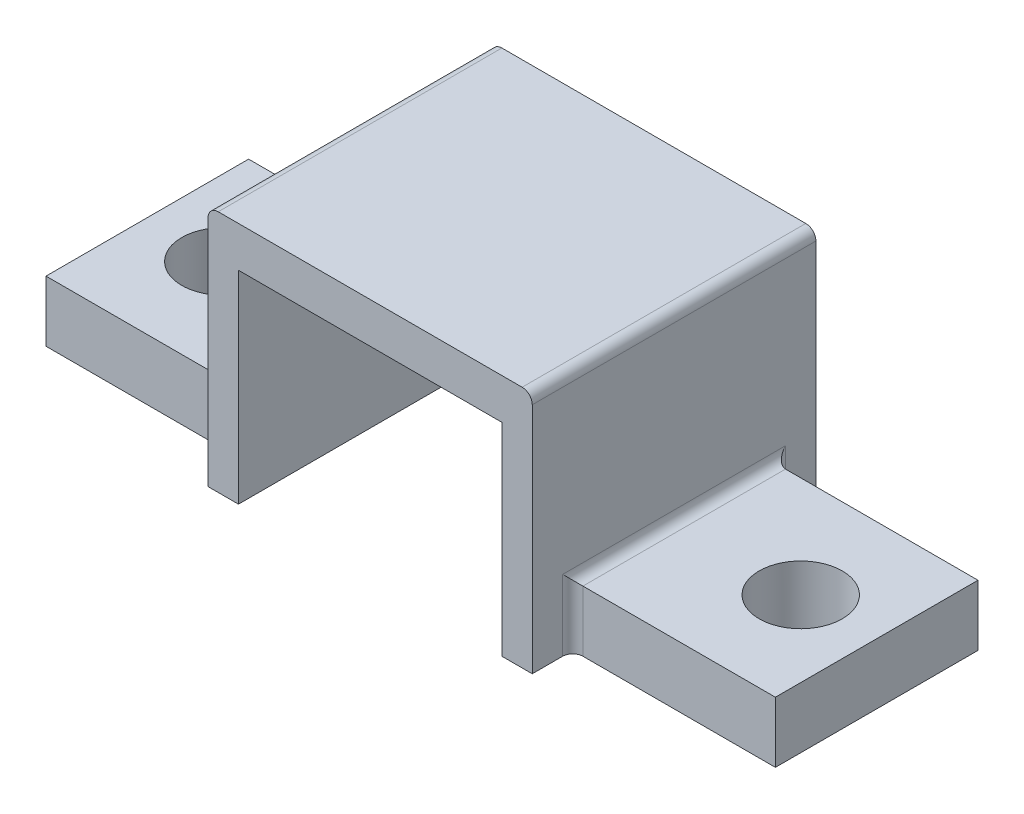
ISO-10303-21;
HEADER;
FILE_DESCRIPTION(('STEP AP214'),'2;1');
FILE_NAME('part.step','',(''),(''),'','','');
FILE_SCHEMA(('AUTOMOTIVE_DESIGN { 1 0 10303 214 1 1 1 1 }'));
ENDSEC;
DATA;
#1=APPLICATION_CONTEXT('core data for automotive mechanical design processes');
#2=APPLICATION_PROTOCOL_DEFINITION('international standard','automotive_design',2000,#1);
#3=PRODUCT_CONTEXT('',#1,'mechanical');
#4=PRODUCT('Part','Part','',(#3));
#5=PRODUCT_RELATED_PRODUCT_CATEGORY('part','',(#4));
#6=PRODUCT_DEFINITION_FORMATION('','',#4);
#7=PRODUCT_DEFINITION_CONTEXT('part definition',#1,'design');
#8=PRODUCT_DEFINITION('design','',#6,#7);
#9=PRODUCT_DEFINITION_SHAPE('','',#8);
#10=(LENGTH_UNIT() NAMED_UNIT(*) SI_UNIT(.MILLI.,.METRE.));
#11=(NAMED_UNIT(*) PLANE_ANGLE_UNIT() SI_UNIT($,.RADIAN.));
#12=(NAMED_UNIT(*) SI_UNIT($,.STERADIAN.) SOLID_ANGLE_UNIT());
#13=UNCERTAINTY_MEASURE_WITH_UNIT(LENGTH_MEASURE(1.E-05),#10,'distance_accuracy_value','');
#14=(GEOMETRIC_REPRESENTATION_CONTEXT(3) GLOBAL_UNCERTAINTY_ASSIGNED_CONTEXT((#13)) GLOBAL_UNIT_ASSIGNED_CONTEXT((#10,
#11,#12)) REPRESENTATION_CONTEXT('',''));
#15=CARTESIAN_POINT('',(0.,0.,0.));
#16=DIRECTION('',(0.,0.,1.));
#17=DIRECTION('',(1.,0.,0.));
#18=AXIS2_PLACEMENT_3D('',#15,#16,#17);
#19=CARTESIAN_POINT('',(8.,-6.,7.));
#20=DIRECTION('',(-1.,0.,0.));
#21=DIRECTION('',(0.,0.,1.));
#22=AXIS2_PLACEMENT_3D('',#19,#20,#21);
#23=PLANE('',#22);
#24=DIRECTION('',(0.,1.,0.));
#25=VECTOR('',#24,1.);
#26=CARTESIAN_POINT('',(8.,-6.,-7.));
#27=LINE('',#26,#25);
#28=CARTESIAN_POINT('',(8.,-6.,-7.));
#29=VERTEX_POINT('',#28);
#30=CARTESIAN_POINT('',(8.,5.5,-7.));
#31=VERTEX_POINT('',#30);
#32=EDGE_CURVE('E273',#29,#31,#27,.T.);
#33=ORIENTED_EDGE('',*,*,#32,.T.);
#34=DIRECTION('',(0.,0.,-1.));
#35=VECTOR('',#34,1.);
#36=CARTESIAN_POINT('',(8.,5.5,7.));
#37=LINE('',#36,#35);
#38=CARTESIAN_POINT('',(8.,5.5,7.));
#39=VERTEX_POINT('',#38);
#40=EDGE_CURVE('E326',#31,#39,#37,.F.);
#41=ORIENTED_EDGE('',*,*,#40,.T.);
#42=DIRECTION('',(0.,1.,0.));
#43=VECTOR('',#42,1.);
#44=CARTESIAN_POINT('',(8.,-6.,7.));
#45=LINE('',#44,#43);
#46=CARTESIAN_POINT('',(8.,-6.,7.));
#47=VERTEX_POINT('',#46);
#48=EDGE_CURVE('E280',#47,#39,#45,.T.);
#49=ORIENTED_EDGE('',*,*,#48,.F.);
#50=DIRECTION('',(0.,0.,-1.));
#51=VECTOR('',#50,1.);
#52=CARTESIAN_POINT('',(8.,-6.,7.));
#53=LINE('',#52,#51);
#54=CARTESIAN_POINT('',(8.,-6.,5.5));
#55=VERTEX_POINT('',#54);
#56=EDGE_CURVE('E305',#47,#55,#53,.T.);
#57=ORIENTED_EDGE('',*,*,#56,.T.);
#58=DIRECTION('',(0.,-1.,0.));
#59=VECTOR('',#58,1.);
#60=CARTESIAN_POINT('',(8.,-6.,5.5));
#61=LINE('',#60,#59);
#62=CARTESIAN_POINT('',(8.,-2.5,5.5));
#63=VERTEX_POINT('',#62);
#64=EDGE_CURVE('E324',#55,#63,#61,.F.);
#65=ORIENTED_EDGE('',*,*,#64,.T.);
#66=DIRECTION('',(0.,0.,1.));
#67=VECTOR('',#66,1.);
#68=CARTESIAN_POINT('',(8.,-2.5,-5.));
#69=LINE('',#68,#67);
#70=CARTESIAN_POINT('',(8.,-2.5,-5.5));
#71=VERTEX_POINT('',#70);
#72=EDGE_CURVE('E322',#63,#71,#69,.F.);
#73=ORIENTED_EDGE('',*,*,#72,.T.);
#74=DIRECTION('',(0.,-1.,0.));
#75=VECTOR('',#74,1.);
#76=CARTESIAN_POINT('',(8.,-6.,-5.5));
#77=LINE('',#76,#75);
#78=CARTESIAN_POINT('',(8.,-6.,-5.5));
#79=VERTEX_POINT('',#78);
#80=EDGE_CURVE('E320',#71,#79,#77,.T.);
#81=ORIENTED_EDGE('',*,*,#80,.T.);
#82=EDGE_CURVE('E293',#79,#29,#53,.T.);
#83=ORIENTED_EDGE('',*,*,#82,.T.);
#84=EDGE_LOOP('',(#33,#41,#49,#57,#65,#73,#81,#83));
#85=FACE_BOUND('',#84,.T.);
#86=ADVANCED_FACE('F43',(#85),#23,.F.);
#87=CARTESIAN_POINT('',(-8.,-6.,7.));
#88=DIRECTION('',(1.,0.,0.));
#89=DIRECTION('',(0.,0.,-1.));
#90=AXIS2_PLACEMENT_3D('',#87,#88,#89);
#91=PLANE('',#90);
#92=DIRECTION('',(0.,-1.,0.));
#93=VECTOR('',#92,1.);
#94=CARTESIAN_POINT('',(-8.,-6.,7.));
#95=LINE('',#94,#93);
#96=CARTESIAN_POINT('',(-8.,5.5,7.));
#97=VERTEX_POINT('',#96);
#98=CARTESIAN_POINT('',(-8.,-6.,7.));
#99=VERTEX_POINT('',#98);
#100=EDGE_CURVE('E287',#97,#99,#95,.T.);
#101=ORIENTED_EDGE('',*,*,#100,.F.);
#102=DIRECTION('',(0.,0.,-1.));
#103=VECTOR('',#102,1.);
#104=CARTESIAN_POINT('',(-8.,5.5,7.));
#105=LINE('',#104,#103);
#106=CARTESIAN_POINT('',(-8.,5.5,-7.));
#107=VERTEX_POINT('',#106);
#108=EDGE_CURVE('E338',#97,#107,#105,.T.);
#109=ORIENTED_EDGE('',*,*,#108,.T.);
#110=DIRECTION('',(0.,-1.,0.));
#111=VECTOR('',#110,1.);
#112=CARTESIAN_POINT('',(-8.,-6.,-7.));
#113=LINE('',#112,#111);
#114=CARTESIAN_POINT('',(-8.,-6.,-7.));
#115=VERTEX_POINT('',#114);
#116=EDGE_CURVE('E299',#107,#115,#113,.T.);
#117=ORIENTED_EDGE('',*,*,#116,.T.);
#118=DIRECTION('',(0.,0.,-1.));
#119=VECTOR('',#118,1.);
#120=CARTESIAN_POINT('',(-8.,-6.,7.));
#121=LINE('',#120,#119);
#122=CARTESIAN_POINT('',(-8.,-6.,-5.5));
#123=VERTEX_POINT('',#122);
#124=EDGE_CURVE('E308',#123,#115,#121,.T.);
#125=ORIENTED_EDGE('',*,*,#124,.F.);
#126=DIRECTION('',(0.,-1.,0.));
#127=VECTOR('',#126,1.);
#128=CARTESIAN_POINT('',(-8.,-6.,-5.5));
#129=LINE('',#128,#127);
#130=CARTESIAN_POINT('',(-8.,-2.5,-5.5));
#131=VERTEX_POINT('',#130);
#132=EDGE_CURVE('E336',#123,#131,#129,.F.);
#133=ORIENTED_EDGE('',*,*,#132,.T.);
#134=DIRECTION('',(0.,0.,-1.));
#135=VECTOR('',#134,1.);
#136=CARTESIAN_POINT('',(-8.,-2.5,5.));
#137=LINE('',#136,#135);
#138=CARTESIAN_POINT('',(-8.,-2.5,5.5));
#139=VERTEX_POINT('',#138);
#140=EDGE_CURVE('E334',#131,#139,#137,.F.);
#141=ORIENTED_EDGE('',*,*,#140,.T.);
#142=DIRECTION('',(0.,-1.,0.));
#143=VECTOR('',#142,1.);
#144=CARTESIAN_POINT('',(-8.,-6.,5.5));
#145=LINE('',#144,#143);
#146=CARTESIAN_POINT('',(-8.,-6.,5.5));
#147=VERTEX_POINT('',#146);
#148=EDGE_CURVE('E332',#139,#147,#145,.T.);
#149=ORIENTED_EDGE('',*,*,#148,.T.);
#150=EDGE_CURVE('E309',#99,#147,#121,.T.);
#151=ORIENTED_EDGE('',*,*,#150,.F.);
#152=EDGE_LOOP('',(#101,#109,#117,#125,#133,#141,#149,#151));
#153=FACE_BOUND('',#152,.T.);
#154=ADVANCED_FACE('F420',(#153),#91,.F.);
#155=CARTESIAN_POINT('',(-8.,-6.,7.));
#156=DIRECTION('',(0.,1.,0.));
#157=DIRECTION('',(0.,0.,1.));
#158=AXIS2_PLACEMENT_3D('',#155,#156,#157);
#159=PLANE('',#158);
#160=CARTESIAN_POINT('',(14.25,-6.,0.));
#161=DIRECTION('',(0.,1.,0.));
#162=DIRECTION('',(0.,0.,1.));
#163=AXIS2_PLACEMENT_3D('',#160,#161,#162);
#164=CIRCLE('',#163,2.05);
#165=CARTESIAN_POINT('',(14.25,-6.,2.05));
#166=VERTEX_POINT('',#165);
#167=EDGE_CURVE('E367',#166,#166,#164,.F.);
#168=ORIENTED_EDGE('',*,*,#167,.F.);
#169=EDGE_LOOP('',(#168));
#170=FACE_BOUND('',#169,.T.);
#171=DIRECTION('',(1.,0.,0.));
#172=VECTOR('',#171,1.);
#173=CARTESIAN_POINT('',(-8.,-6.,7.));
#174=LINE('',#173,#172);
#175=CARTESIAN_POINT('',(6.5,-6.,7.));
#176=VERTEX_POINT('',#175);
#177=EDGE_CURVE('E289',#176,#47,#174,.T.);
#178=ORIENTED_EDGE('',*,*,#177,.F.);
#179=DIRECTION('',(0.,0.,1.));
#180=VECTOR('',#179,1.);
#181=CARTESIAN_POINT('',(6.5,-6.,-7.));
#182=LINE('',#181,#180);
#183=CARTESIAN_POINT('',(6.5,-6.,-7.));
#184=VERTEX_POINT('',#183);
#185=EDGE_CURVE('E271',#184,#176,#182,.T.);
#186=ORIENTED_EDGE('',*,*,#185,.F.);
#187=DIRECTION('',(1.,0.,0.));
#188=VECTOR('',#187,1.);
#189=CARTESIAN_POINT('',(-8.,-6.,-7.));
#190=LINE('',#189,#188);
#191=EDGE_CURVE('E302',#184,#29,#190,.T.);
#192=ORIENTED_EDGE('',*,*,#191,.T.);
#193=ORIENTED_EDGE('',*,*,#82,.F.);
#194=CARTESIAN_POINT('',(8.5,-6.,-5.5));
#195=DIRECTION('',(0.,1.,0.));
#196=DIRECTION('',(0.,0.,1.));
#197=AXIS2_PLACEMENT_3D('',#194,#195,#196);
#198=CIRCLE('',#197,0.5);
#199=CARTESIAN_POINT('',(8.5,-6.,-5.));
#200=VERTEX_POINT('',#199);
#201=EDGE_CURVE('E354',#79,#200,#198,.T.);
#202=ORIENTED_EDGE('',*,*,#201,.T.);
#203=DIRECTION('',(-1.,0.,0.));
#204=VECTOR('',#203,1.);
#205=CARTESIAN_POINT('',(0.,-6.,-5.));
#206=LINE('',#205,#204);
#207=CARTESIAN_POINT('',(18.,-6.,-5.));
#208=VERTEX_POINT('',#207);
#209=EDGE_CURVE('E243',#208,#200,#206,.T.);
#210=ORIENTED_EDGE('',*,*,#209,.F.);
#211=DIRECTION('',(0.,0.,1.));
#212=VECTOR('',#211,1.);
#213=CARTESIAN_POINT('',(18.,-6.,0.));
#214=LINE('',#213,#212);
#215=CARTESIAN_POINT('',(18.,-6.,5.));
#216=VERTEX_POINT('',#215);
#217=EDGE_CURVE('E246',#208,#216,#214,.T.);
#218=ORIENTED_EDGE('',*,*,#217,.T.);
#219=DIRECTION('',(-1.,0.,0.));
#220=VECTOR('',#219,1.);
#221=CARTESIAN_POINT('',(0.,-6.,5.));
#222=LINE('',#221,#220);
#223=CARTESIAN_POINT('',(8.5,-6.,5.));
#224=VERTEX_POINT('',#223);
#225=EDGE_CURVE('E236',#216,#224,#222,.T.);
#226=ORIENTED_EDGE('',*,*,#225,.T.);
#227=CARTESIAN_POINT('',(8.5,-6.,5.5));
#228=DIRECTION('',(0.,1.,0.));
#229=DIRECTION('',(0.,0.,1.));
#230=AXIS2_PLACEMENT_3D('',#227,#228,#229);
#231=CIRCLE('',#230,0.5);
#232=EDGE_CURVE('E352',#224,#55,#231,.T.);
#233=ORIENTED_EDGE('',*,*,#232,.T.);
#234=ORIENTED_EDGE('',*,*,#56,.F.);
#235=EDGE_LOOP('',(#178,#186,#192,#193,#202,#210,#218,#226,#233,#234));
#236=FACE_BOUND('',#235,.T.);
#237=ADVANCED_FACE('F386',(#170,#236),#159,.F.);
#238=CARTESIAN_POINT('',(-8.,6.,7.));
#239=DIRECTION('',(0.,-1.,0.));
#240=DIRECTION('',(0.,0.,-1.));
#241=AXIS2_PLACEMENT_3D('',#238,#239,#240);
#242=PLANE('',#241);
#243=DIRECTION('',(-1.,0.,0.));
#244=VECTOR('',#243,1.);
#245=CARTESIAN_POINT('',(-8.,6.,7.));
#246=LINE('',#245,#244);
#247=CARTESIAN_POINT('',(7.5,6.,7.));
#248=VERTEX_POINT('',#247);
#249=CARTESIAN_POINT('',(-7.5,6.,7.));
#250=VERTEX_POINT('',#249);
#251=EDGE_CURVE('E283',#248,#250,#246,.T.);
#252=ORIENTED_EDGE('',*,*,#251,.F.);
#253=DIRECTION('',(0.,0.,-1.));
#254=VECTOR('',#253,1.);
#255=CARTESIAN_POINT('',(7.5,6.,7.));
#256=LINE('',#255,#254);
#257=CARTESIAN_POINT('',(7.5,6.,-7.));
#258=VERTEX_POINT('',#257);
#259=EDGE_CURVE('E313',#248,#258,#256,.T.);
#260=ORIENTED_EDGE('',*,*,#259,.T.);
#261=DIRECTION('',(-1.,0.,0.));
#262=VECTOR('',#261,1.);
#263=CARTESIAN_POINT('',(-8.,6.,-7.));
#264=LINE('',#263,#262);
#265=CARTESIAN_POINT('',(-7.5,6.,-7.));
#266=VERTEX_POINT('',#265);
#267=EDGE_CURVE('E296',#258,#266,#264,.T.);
#268=ORIENTED_EDGE('',*,*,#267,.T.);
#269=DIRECTION('',(0.,0.,-1.));
#270=VECTOR('',#269,1.);
#271=CARTESIAN_POINT('',(-7.5,6.,7.));
#272=LINE('',#271,#270);
#273=EDGE_CURVE('E311',#266,#250,#272,.F.);
#274=ORIENTED_EDGE('',*,*,#273,.T.);
#275=EDGE_LOOP('',(#252,#260,#268,#274));
#276=FACE_BOUND('',#275,.T.);
#277=ADVANCED_FACE('F384',(#276),#242,.F.);
#278=CARTESIAN_POINT('',(-14.25,-6.,0.));
#279=DIRECTION('',(0.,1.,0.));
#280=DIRECTION('',(0.,0.,1.));
#281=AXIS2_PLACEMENT_3D('',#278,#279,#280);
#282=CIRCLE('',#281,2.05);
#283=CARTESIAN_POINT('',(-14.25,-6.,2.05));
#284=VERTEX_POINT('',#283);
#285=EDGE_CURVE('E222',#284,#284,#282,.F.);
#286=ORIENTED_EDGE('',*,*,#285,.F.);
#287=EDGE_LOOP('',(#286));
#288=FACE_BOUND('',#287,.T.);
#289=CARTESIAN_POINT('',(-6.5,-6.,-7.));
#290=VERTEX_POINT('',#289);
#291=EDGE_CURVE('E284',#115,#290,#190,.T.);
#292=ORIENTED_EDGE('',*,*,#291,.T.);
#293=DIRECTION('',(0.,0.,1.));
#294=VECTOR('',#293,1.);
#295=CARTESIAN_POINT('',(-6.5,-6.,-7.));
#296=LINE('',#295,#294);
#297=CARTESIAN_POINT('',(-6.5,-6.,7.));
#298=VERTEX_POINT('',#297);
#299=EDGE_CURVE('E274',#290,#298,#296,.T.);
#300=ORIENTED_EDGE('',*,*,#299,.T.);
#301=EDGE_CURVE('E290',#99,#298,#174,.T.);
#302=ORIENTED_EDGE('',*,*,#301,.F.);
#303=ORIENTED_EDGE('',*,*,#150,.T.);
#304=CARTESIAN_POINT('',(-8.5,-6.,5.5));
#305=DIRECTION('',(0.,1.,0.));
#306=DIRECTION('',(0.,0.,1.));
#307=AXIS2_PLACEMENT_3D('',#304,#305,#306);
#308=CIRCLE('',#307,0.5);
#309=CARTESIAN_POINT('',(-8.5,-6.,5.));
#310=VERTEX_POINT('',#309);
#311=EDGE_CURVE('E11',#147,#310,#308,.T.);
#312=ORIENTED_EDGE('',*,*,#311,.T.);
#313=DIRECTION('',(1.,0.,0.));
#314=VECTOR('',#313,1.);
#315=CARTESIAN_POINT('',(0.,-6.,5.));
#316=LINE('',#315,#314);
#317=CARTESIAN_POINT('',(-18.,-6.,5.));
#318=VERTEX_POINT('',#317);
#319=EDGE_CURVE('E226',#318,#310,#316,.T.);
#320=ORIENTED_EDGE('',*,*,#319,.F.);
#321=DIRECTION('',(0.,0.,1.));
#322=VECTOR('',#321,1.);
#323=CARTESIAN_POINT('',(-18.,-6.,0.));
#324=LINE('',#323,#322);
#325=CARTESIAN_POINT('',(-18.,-6.,-5.));
#326=VERTEX_POINT('',#325);
#327=EDGE_CURVE('E211',#326,#318,#324,.T.);
#328=ORIENTED_EDGE('',*,*,#327,.F.);
#329=DIRECTION('',(1.,0.,0.));
#330=VECTOR('',#329,1.);
#331=CARTESIAN_POINT('',(0.,-6.,-5.));
#332=LINE('',#331,#330);
#333=CARTESIAN_POINT('',(-8.5,-6.,-5.));
#334=VERTEX_POINT('',#333);
#335=EDGE_CURVE('E218',#326,#334,#332,.T.);
#336=ORIENTED_EDGE('',*,*,#335,.T.);
#337=CARTESIAN_POINT('',(-8.5,-6.,-5.5));
#338=DIRECTION('',(0.,1.,0.));
#339=DIRECTION('',(0.,0.,1.));
#340=AXIS2_PLACEMENT_3D('',#337,#338,#339);
#341=CIRCLE('',#340,0.5);
#342=EDGE_CURVE('E52',#334,#123,#341,.T.);
#343=ORIENTED_EDGE('',*,*,#342,.T.);
#344=ORIENTED_EDGE('',*,*,#124,.T.);
#345=EDGE_LOOP('',(#292,#300,#302,#303,#312,#320,#328,#336,#343,#344));
#346=FACE_BOUND('',#345,.T.);
#347=ADVANCED_FACE('F381',(#288,#346),#159,.F.);
#348=CARTESIAN_POINT('',(0.,0.,7.));
#349=DIRECTION('',(0.,0.,-1.));
#350=DIRECTION('',(-1.,0.,0.));
#351=AXIS2_PLACEMENT_3D('',#348,#349,#350);
#352=PLANE('',#351);
#353=ORIENTED_EDGE('',*,*,#48,.T.);
#354=CARTESIAN_POINT('',(7.5,5.5,7.));
#355=DIRECTION('',(0.,0.,-1.));
#356=DIRECTION('',(-1.,0.,0.));
#357=AXIS2_PLACEMENT_3D('',#354,#355,#356);
#358=CIRCLE('',#357,0.5);
#359=EDGE_CURVE('E330',#39,#248,#358,.F.);
#360=ORIENTED_EDGE('',*,*,#359,.T.);
#361=ORIENTED_EDGE('',*,*,#251,.T.);
#362=CARTESIAN_POINT('',(-7.5,5.5,7.));
#363=DIRECTION('',(0.,0.,-1.));
#364=DIRECTION('',(-1.,0.,0.));
#365=AXIS2_PLACEMENT_3D('',#362,#363,#364);
#366=CIRCLE('',#365,0.5);
#367=EDGE_CURVE('E328',#250,#97,#366,.F.);
#368=ORIENTED_EDGE('',*,*,#367,.T.);
#369=ORIENTED_EDGE('',*,*,#100,.T.);
#370=ORIENTED_EDGE('',*,*,#301,.T.);
#371=DIRECTION('',(0.,-1.,0.));
#372=VECTOR('',#371,1.);
#373=CARTESIAN_POINT('',(-6.5,4.,7.));
#374=LINE('',#373,#372);
#375=CARTESIAN_POINT('',(-6.5,4.,7.));
#376=VERTEX_POINT('',#375);
#377=EDGE_CURVE('E258',#376,#298,#374,.T.);
#378=ORIENTED_EDGE('',*,*,#377,.F.);
#379=DIRECTION('',(-1.,0.,0.));
#380=VECTOR('',#379,1.);
#381=CARTESIAN_POINT('',(-6.5,4.,7.));
#382=LINE('',#381,#380);
#383=CARTESIAN_POINT('',(6.5,4.,7.));
#384=VERTEX_POINT('',#383);
#385=EDGE_CURVE('E267',#384,#376,#382,.T.);
#386=ORIENTED_EDGE('',*,*,#385,.F.);
#387=DIRECTION('',(0.,1.,0.));
#388=VECTOR('',#387,1.);
#389=CARTESIAN_POINT('',(6.5,4.,7.));
#390=LINE('',#389,#388);
#391=EDGE_CURVE('E230',#176,#384,#390,.T.);
#392=ORIENTED_EDGE('',*,*,#391,.F.);
#393=ORIENTED_EDGE('',*,*,#177,.T.);
#394=EDGE_LOOP('',(#353,#360,#361,#368,#369,#370,#378,#386,#392,#393));
#395=FACE_BOUND('',#394,.T.);
#396=ADVANCED_FACE('F383',(#395),#352,.F.);
#397=CARTESIAN_POINT('',(0.,0.,-7.));
#398=DIRECTION('',(0.,0.,-1.));
#399=DIRECTION('',(-1.,0.,0.));
#400=AXIS2_PLACEMENT_3D('',#397,#398,#399);
#401=PLANE('',#400);
#402=ORIENTED_EDGE('',*,*,#267,.F.);
#403=CARTESIAN_POINT('',(7.5,5.5,-7.));
#404=DIRECTION('',(0.,0.,-1.));
#405=DIRECTION('',(-1.,0.,0.));
#406=AXIS2_PLACEMENT_3D('',#403,#404,#405);
#407=CIRCLE('',#406,0.5);
#408=EDGE_CURVE('E318',#258,#31,#407,.T.);
#409=ORIENTED_EDGE('',*,*,#408,.T.);
#410=ORIENTED_EDGE('',*,*,#32,.F.);
#411=ORIENTED_EDGE('',*,*,#191,.F.);
#412=DIRECTION('',(0.,1.,0.));
#413=VECTOR('',#412,1.);
#414=CARTESIAN_POINT('',(6.5,4.,-7.));
#415=LINE('',#414,#413);
#416=CARTESIAN_POINT('',(6.5,4.,-7.));
#417=VERTEX_POINT('',#416);
#418=EDGE_CURVE('E254',#184,#417,#415,.T.);
#419=ORIENTED_EDGE('',*,*,#418,.T.);
#420=DIRECTION('',(-1.,0.,0.));
#421=VECTOR('',#420,1.);
#422=CARTESIAN_POINT('',(-6.5,4.,-7.));
#423=LINE('',#422,#421);
#424=CARTESIAN_POINT('',(-6.5,4.,-7.));
#425=VERTEX_POINT('',#424);
#426=EDGE_CURVE('E257',#417,#425,#423,.T.);
#427=ORIENTED_EDGE('',*,*,#426,.T.);
#428=DIRECTION('',(0.,-1.,0.));
#429=VECTOR('',#428,1.);
#430=CARTESIAN_POINT('',(-6.5,4.,-7.));
#431=LINE('',#430,#429);
#432=EDGE_CURVE('E261',#425,#290,#431,.T.);
#433=ORIENTED_EDGE('',*,*,#432,.T.);
#434=ORIENTED_EDGE('',*,*,#291,.F.);
#435=ORIENTED_EDGE('',*,*,#116,.F.);
#436=CARTESIAN_POINT('',(-7.5,5.5,-7.));
#437=DIRECTION('',(0.,0.,-1.));
#438=DIRECTION('',(-1.,0.,0.));
#439=AXIS2_PLACEMENT_3D('',#436,#437,#438);
#440=CIRCLE('',#439,0.5);
#441=EDGE_CURVE('E316',#107,#266,#440,.T.);
#442=ORIENTED_EDGE('',*,*,#441,.T.);
#443=EDGE_LOOP('',(#402,#409,#410,#411,#419,#427,#433,#434,#435,#442));
#444=FACE_BOUND('',#443,.T.);
#445=ADVANCED_FACE('F393',(#444),#401,.T.);
#446=CARTESIAN_POINT('',(6.5,4.,-7.));
#447=DIRECTION('',(1.,0.,0.));
#448=DIRECTION('',(0.,1.,0.));
#449=AXIS2_PLACEMENT_3D('',#446,#447,#448);
#450=PLANE('',#449);
#451=ORIENTED_EDGE('',*,*,#391,.T.);
#452=DIRECTION('',(0.,0.,1.));
#453=VECTOR('',#452,1.);
#454=CARTESIAN_POINT('',(6.5,4.,-7.));
#455=LINE('',#454,#453);
#456=EDGE_CURVE('E264',#417,#384,#455,.T.);
#457=ORIENTED_EDGE('',*,*,#456,.F.);
#458=ORIENTED_EDGE('',*,*,#418,.F.);
#459=ORIENTED_EDGE('',*,*,#185,.T.);
#460=EDGE_LOOP('',(#451,#457,#458,#459));
#461=FACE_BOUND('',#460,.T.);
#462=ADVANCED_FACE('F445',(#461),#450,.F.);
#463=CARTESIAN_POINT('',(-6.5,4.,-7.));
#464=DIRECTION('',(-1.,0.,0.));
#465=DIRECTION('',(0.,-1.,0.));
#466=AXIS2_PLACEMENT_3D('',#463,#464,#465);
#467=PLANE('',#466);
#468=ORIENTED_EDGE('',*,*,#377,.T.);
#469=ORIENTED_EDGE('',*,*,#299,.F.);
#470=ORIENTED_EDGE('',*,*,#432,.F.);
#471=DIRECTION('',(0.,0.,1.));
#472=VECTOR('',#471,1.);
#473=CARTESIAN_POINT('',(-6.5,4.,-7.));
#474=LINE('',#473,#472);
#475=EDGE_CURVE('E277',#425,#376,#474,.T.);
#476=ORIENTED_EDGE('',*,*,#475,.T.);
#477=EDGE_LOOP('',(#468,#469,#470,#476));
#478=FACE_BOUND('',#477,.T.);
#479=ADVANCED_FACE('F397',(#478),#467,.F.);
#480=CARTESIAN_POINT('',(-6.5,4.,-7.));
#481=DIRECTION('',(0.,1.,0.));
#482=DIRECTION('',(0.,0.,1.));
#483=AXIS2_PLACEMENT_3D('',#480,#481,#482);
#484=PLANE('',#483);
#485=ORIENTED_EDGE('',*,*,#385,.T.);
#486=ORIENTED_EDGE('',*,*,#475,.F.);
#487=ORIENTED_EDGE('',*,*,#426,.F.);
#488=ORIENTED_EDGE('',*,*,#456,.T.);
#489=EDGE_LOOP('',(#485,#486,#487,#488));
#490=FACE_BOUND('',#489,.T.);
#491=ADVANCED_FACE('F399',(#490),#484,.F.);
#492=CARTESIAN_POINT('',(0.,-3.,5.));
#493=DIRECTION('',(0.,0.,-1.));
#494=DIRECTION('',(-1.,0.,0.));
#495=AXIS2_PLACEMENT_3D('',#492,#493,#494);
#496=PLANE('',#495);
#497=ORIENTED_EDGE('',*,*,#319,.T.);
#498=DIRECTION('',(0.,-1.,0.));
#499=VECTOR('',#498,1.);
#500=CARTESIAN_POINT('',(-8.5,-3.,5.));
#501=LINE('',#500,#499);
#502=CARTESIAN_POINT('',(-8.5,-3.,5.));
#503=VERTEX_POINT('',#502);
#504=EDGE_CURVE('E217',#310,#503,#501,.F.);
#505=ORIENTED_EDGE('',*,*,#504,.T.);
#506=DIRECTION('',(1.,0.,0.));
#507=VECTOR('',#506,1.);
#508=CARTESIAN_POINT('',(0.,-3.,5.));
#509=LINE('',#508,#507);
#510=CARTESIAN_POINT('',(-18.,-3.,5.));
#511=VERTEX_POINT('',#510);
#512=EDGE_CURVE('E202',#511,#503,#509,.T.);
#513=ORIENTED_EDGE('',*,*,#512,.F.);
#514=DIRECTION('',(0.,-1.,0.));
#515=VECTOR('',#514,1.);
#516=CARTESIAN_POINT('',(-18.,-3.,5.));
#517=LINE('',#516,#515);
#518=EDGE_CURVE('E208',#511,#318,#517,.T.);
#519=ORIENTED_EDGE('',*,*,#518,.T.);
#520=EDGE_LOOP('',(#497,#505,#513,#519));
#521=FACE_BOUND('',#520,.T.);
#522=ADVANCED_FACE('F215',(#521),#496,.F.);
#523=CARTESIAN_POINT('',(0.,-3.,-5.));
#524=DIRECTION('',(0.,0.,-1.));
#525=DIRECTION('',(-1.,0.,0.));
#526=AXIS2_PLACEMENT_3D('',#523,#524,#525);
#527=PLANE('',#526);
#528=DIRECTION('',(1.,0.,0.));
#529=VECTOR('',#528,1.);
#530=CARTESIAN_POINT('',(0.,-3.,-5.));
#531=LINE('',#530,#529);
#532=CARTESIAN_POINT('',(-18.,-3.,-5.));
#533=VERTEX_POINT('',#532);
#534=CARTESIAN_POINT('',(-8.5,-3.,-5.));
#535=VERTEX_POINT('',#534);
#536=EDGE_CURVE('E204',#533,#535,#531,.T.);
#537=ORIENTED_EDGE('',*,*,#536,.T.);
#538=DIRECTION('',(0.,-1.,0.));
#539=VECTOR('',#538,1.);
#540=CARTESIAN_POINT('',(-8.5,-3.,-5.));
#541=LINE('',#540,#539);
#542=EDGE_CURVE('E66',#535,#334,#541,.T.);
#543=ORIENTED_EDGE('',*,*,#542,.T.);
#544=ORIENTED_EDGE('',*,*,#335,.F.);
#545=DIRECTION('',(0.,-1.,0.));
#546=VECTOR('',#545,1.);
#547=CARTESIAN_POINT('',(-18.,-3.,-5.));
#548=LINE('',#547,#546);
#549=EDGE_CURVE('E213',#533,#326,#548,.T.);
#550=ORIENTED_EDGE('',*,*,#549,.F.);
#551=EDGE_LOOP('',(#537,#543,#544,#550));
#552=FACE_BOUND('',#551,.T.);
#553=ADVANCED_FACE('F415',(#552),#527,.T.);
#554=CARTESIAN_POINT('',(-18.,-3.,0.));
#555=DIRECTION('',(1.,0.,0.));
#556=DIRECTION('',(0.,0.,-1.));
#557=AXIS2_PLACEMENT_3D('',#554,#555,#556);
#558=PLANE('',#557);
#559=ORIENTED_EDGE('',*,*,#327,.T.);
#560=ORIENTED_EDGE('',*,*,#518,.F.);
#561=DIRECTION('',(0.,0.,1.));
#562=VECTOR('',#561,1.);
#563=CARTESIAN_POINT('',(-18.,-3.,0.));
#564=LINE('',#563,#562);
#565=EDGE_CURVE('E197',#533,#511,#564,.T.);
#566=ORIENTED_EDGE('',*,*,#565,.F.);
#567=ORIENTED_EDGE('',*,*,#549,.T.);
#568=EDGE_LOOP('',(#559,#560,#566,#567));
#569=FACE_BOUND('',#568,.T.);
#570=ADVANCED_FACE('F209',(#569),#558,.F.);
#571=CARTESIAN_POINT('',(0.,-3.,0.));
#572=DIRECTION('',(0.,-1.,0.));
#573=DIRECTION('',(0.,0.,-1.));
#574=AXIS2_PLACEMENT_3D('',#571,#572,#573);
#575=PLANE('',#574);
#576=CARTESIAN_POINT('',(-14.25,-3.,0.));
#577=DIRECTION('',(0.,-1.,0.));
#578=DIRECTION('',(0.,0.,-1.));
#579=AXIS2_PLACEMENT_3D('',#576,#577,#578);
#580=CIRCLE('',#579,2.05);
#581=CARTESIAN_POINT('',(-14.25,-3.,-2.05));
#582=VERTEX_POINT('',#581);
#583=EDGE_CURVE('E47',#582,#582,#580,.F.);
#584=ORIENTED_EDGE('',*,*,#583,.F.);
#585=EDGE_LOOP('',(#584));
#586=FACE_BOUND('',#585,.T.);
#587=ORIENTED_EDGE('',*,*,#512,.T.);
#588=DIRECTION('',(0.,0.,-1.));
#589=VECTOR('',#588,1.);
#590=CARTESIAN_POINT('',(-8.5,-3.,-5.));
#591=LINE('',#590,#589);
#592=EDGE_CURVE('E341',#503,#535,#591,.T.);
#593=ORIENTED_EDGE('',*,*,#592,.T.);
#594=ORIENTED_EDGE('',*,*,#536,.F.);
#595=ORIENTED_EDGE('',*,*,#565,.T.);
#596=EDGE_LOOP('',(#587,#593,#594,#595));
#597=FACE_BOUND('',#596,.T.);
#598=ADVANCED_FACE('F199',(#586,#597),#575,.F.);
#599=CARTESIAN_POINT('',(0.,-3.,-5.));
#600=DIRECTION('',(0.,0.,1.));
#601=DIRECTION('',(1.,0.,0.));
#602=AXIS2_PLACEMENT_3D('',#599,#600,#601);
#603=PLANE('',#602);
#604=ORIENTED_EDGE('',*,*,#209,.T.);
#605=DIRECTION('',(0.,-1.,0.));
#606=VECTOR('',#605,1.);
#607=CARTESIAN_POINT('',(8.5,-3.,-5.));
#608=LINE('',#607,#606);
#609=CARTESIAN_POINT('',(8.5,-3.,-5.));
#610=VERTEX_POINT('',#609);
#611=EDGE_CURVE('E348',#200,#610,#608,.F.);
#612=ORIENTED_EDGE('',*,*,#611,.T.);
#613=DIRECTION('',(-1.,0.,0.));
#614=VECTOR('',#613,1.);
#615=CARTESIAN_POINT('',(0.,-3.,-5.));
#616=LINE('',#615,#614);
#617=CARTESIAN_POINT('',(18.,-3.,-5.));
#618=VERTEX_POINT('',#617);
#619=EDGE_CURVE('E232',#618,#610,#616,.T.);
#620=ORIENTED_EDGE('',*,*,#619,.F.);
#621=DIRECTION('',(0.,-1.,0.));
#622=VECTOR('',#621,1.);
#623=CARTESIAN_POINT('',(18.,-3.,-5.));
#624=LINE('',#623,#622);
#625=EDGE_CURVE('E242',#618,#208,#624,.T.);
#626=ORIENTED_EDGE('',*,*,#625,.T.);
#627=EDGE_LOOP('',(#604,#612,#620,#626));
#628=FACE_BOUND('',#627,.T.);
#629=ADVANCED_FACE('F463',(#628),#603,.F.);
#630=CARTESIAN_POINT('',(0.,-3.,5.));
#631=DIRECTION('',(0.,0.,1.));
#632=DIRECTION('',(1.,0.,0.));
#633=AXIS2_PLACEMENT_3D('',#630,#631,#632);
#634=PLANE('',#633);
#635=DIRECTION('',(-1.,0.,0.));
#636=VECTOR('',#635,1.);
#637=CARTESIAN_POINT('',(0.,-3.,5.));
#638=LINE('',#637,#636);
#639=CARTESIAN_POINT('',(18.,-3.,5.));
#640=VERTEX_POINT('',#639);
#641=CARTESIAN_POINT('',(8.5,-3.,5.));
#642=VERTEX_POINT('',#641);
#643=EDGE_CURVE('E239',#640,#642,#638,.T.);
#644=ORIENTED_EDGE('',*,*,#643,.T.);
#645=DIRECTION('',(0.,-1.,0.));
#646=VECTOR('',#645,1.);
#647=CARTESIAN_POINT('',(8.5,-3.,5.));
#648=LINE('',#647,#646);
#649=EDGE_CURVE('E346',#642,#224,#648,.T.);
#650=ORIENTED_EDGE('',*,*,#649,.T.);
#651=ORIENTED_EDGE('',*,*,#225,.F.);
#652=DIRECTION('',(0.,-1.,0.));
#653=VECTOR('',#652,1.);
#654=CARTESIAN_POINT('',(18.,-3.,5.));
#655=LINE('',#654,#653);
#656=EDGE_CURVE('E228',#640,#216,#655,.T.);
#657=ORIENTED_EDGE('',*,*,#656,.F.);
#658=EDGE_LOOP('',(#644,#650,#651,#657));
#659=FACE_BOUND('',#658,.T.);
#660=ADVANCED_FACE('F470',(#659),#634,.T.);
#661=CARTESIAN_POINT('',(18.,-3.,0.));
#662=DIRECTION('',(1.,0.,0.));
#663=DIRECTION('',(0.,0.,-1.));
#664=AXIS2_PLACEMENT_3D('',#661,#662,#663);
#665=PLANE('',#664);
#666=ORIENTED_EDGE('',*,*,#217,.F.);
#667=ORIENTED_EDGE('',*,*,#625,.F.);
#668=DIRECTION('',(0.,0.,1.));
#669=VECTOR('',#668,1.);
#670=CARTESIAN_POINT('',(18.,-3.,0.));
#671=LINE('',#670,#669);
#672=EDGE_CURVE('E235',#618,#640,#671,.T.);
#673=ORIENTED_EDGE('',*,*,#672,.T.);
#674=ORIENTED_EDGE('',*,*,#656,.T.);
#675=EDGE_LOOP('',(#666,#667,#673,#674));
#676=FACE_BOUND('',#675,.T.);
#677=ADVANCED_FACE('F467',(#676),#665,.T.);
#678=CARTESIAN_POINT('',(0.,-3.,0.));
#679=DIRECTION('',(0.,-1.,0.));
#680=DIRECTION('',(0.,0.,-1.));
#681=AXIS2_PLACEMENT_3D('',#678,#679,#680);
#682=PLANE('',#681);
#683=CARTESIAN_POINT('',(14.25,-3.,0.));
#684=DIRECTION('',(0.,-1.,0.));
#685=DIRECTION('',(0.,0.,-1.));
#686=AXIS2_PLACEMENT_3D('',#683,#684,#685);
#687=CIRCLE('',#686,2.05);
#688=CARTESIAN_POINT('',(14.25,-3.,-2.05));
#689=VERTEX_POINT('',#688);
#690=EDGE_CURVE('E365',#689,#689,#687,.F.);
#691=ORIENTED_EDGE('',*,*,#690,.F.);
#692=EDGE_LOOP('',(#691));
#693=FACE_BOUND('',#692,.T.);
#694=ORIENTED_EDGE('',*,*,#619,.T.);
#695=DIRECTION('',(0.,0.,1.));
#696=VECTOR('',#695,1.);
#697=CARTESIAN_POINT('',(8.5,-3.,5.));
#698=LINE('',#697,#696);
#699=EDGE_CURVE('E343',#610,#642,#698,.T.);
#700=ORIENTED_EDGE('',*,*,#699,.T.);
#701=ORIENTED_EDGE('',*,*,#643,.F.);
#702=ORIENTED_EDGE('',*,*,#672,.F.);
#703=EDGE_LOOP('',(#694,#700,#701,#702));
#704=FACE_BOUND('',#703,.T.);
#705=ADVANCED_FACE('F473',(#693,#704),#682,.F.);
#706=CARTESIAN_POINT('',(7.5,5.5,7.));
#707=DIRECTION('',(0.,0.,-1.));
#708=DIRECTION('',(-1.,0.,0.));
#709=AXIS2_PLACEMENT_3D('',#706,#707,#708);
#710=CYLINDRICAL_SURFACE('',#709,0.5);
#711=ORIENTED_EDGE('',*,*,#359,.F.);
#712=ORIENTED_EDGE('',*,*,#40,.F.);
#713=ORIENTED_EDGE('',*,*,#408,.F.);
#714=ORIENTED_EDGE('',*,*,#259,.F.);
#715=EDGE_LOOP('',(#711,#712,#713,#714));
#716=FACE_BOUND('',#715,.T.);
#717=ADVANCED_FACE('F431',(#716),#710,.T.);
#718=CARTESIAN_POINT('',(-7.5,5.5,7.));
#719=DIRECTION('',(0.,0.,-1.));
#720=DIRECTION('',(-1.,0.,0.));
#721=AXIS2_PLACEMENT_3D('',#718,#719,#720);
#722=CYLINDRICAL_SURFACE('',#721,0.5);
#723=ORIENTED_EDGE('',*,*,#367,.F.);
#724=ORIENTED_EDGE('',*,*,#273,.F.);
#725=ORIENTED_EDGE('',*,*,#441,.F.);
#726=ORIENTED_EDGE('',*,*,#108,.F.);
#727=EDGE_LOOP('',(#723,#724,#725,#726));
#728=FACE_BOUND('',#727,.T.);
#729=ADVANCED_FACE('F424',(#728),#722,.T.);
#730=CARTESIAN_POINT('',(-8.5,-6.,5.5));
#731=DIRECTION('',(0.,1.,0.));
#732=DIRECTION('',(0.,0.,1.));
#733=AXIS2_PLACEMENT_3D('',#730,#731,#732);
#734=CYLINDRICAL_SURFACE('',#733,0.5);
#735=ORIENTED_EDGE('',*,*,#311,.F.);
#736=ORIENTED_EDGE('',*,*,#148,.F.);
#737=CARTESIAN_POINT('',(-8.5,-2.5,5.5));
#738=DIRECTION('',(0.,0.707106781186547,-0.707106781186547));
#739=DIRECTION('',(0.,0.707106781186547,0.707106781186547));
#740=AXIS2_PLACEMENT_3D('',#737,#738,#739);
#741=ELLIPSE('',#740,0.707106781186547,0.5);
#742=EDGE_CURVE('E247',#503,#139,#741,.F.);
#743=ORIENTED_EDGE('',*,*,#742,.F.);
#744=ORIENTED_EDGE('',*,*,#504,.F.);
#745=EDGE_LOOP('',(#735,#736,#743,#744));
#746=FACE_BOUND('',#745,.T.);
#747=ADVANCED_FACE('F409',(#746),#734,.F.);
#748=CARTESIAN_POINT('',(-8.5,-3.,-5.5));
#749=DIRECTION('',(0.,-1.,0.));
#750=DIRECTION('',(0.,0.,-1.));
#751=AXIS2_PLACEMENT_3D('',#748,#749,#750);
#752=CYLINDRICAL_SURFACE('',#751,0.5);
#753=ORIENTED_EDGE('',*,*,#342,.F.);
#754=ORIENTED_EDGE('',*,*,#542,.F.);
#755=CARTESIAN_POINT('',(-8.5,-2.5,-5.5));
#756=DIRECTION('',(0.,-0.707106781186547,-0.707106781186547));
#757=DIRECTION('',(0.,-0.707106781186547,0.707106781186547));
#758=AXIS2_PLACEMENT_3D('',#755,#756,#757);
#759=ELLIPSE('',#758,0.707106781186547,0.5);
#760=EDGE_CURVE('E357',#131,#535,#759,.T.);
#761=ORIENTED_EDGE('',*,*,#760,.F.);
#762=ORIENTED_EDGE('',*,*,#132,.F.);
#763=EDGE_LOOP('',(#753,#754,#761,#762));
#764=FACE_BOUND('',#763,.T.);
#765=ADVANCED_FACE('F419',(#764),#752,.F.);
#766=CARTESIAN_POINT('',(-8.5,-2.5,0.));
#767=DIRECTION('',(0.,0.,1.));
#768=DIRECTION('',(1.,0.,0.));
#769=AXIS2_PLACEMENT_3D('',#766,#767,#768);
#770=CYLINDRICAL_SURFACE('',#769,0.5);
#771=ORIENTED_EDGE('',*,*,#742,.T.);
#772=ORIENTED_EDGE('',*,*,#140,.F.);
#773=ORIENTED_EDGE('',*,*,#760,.T.);
#774=ORIENTED_EDGE('',*,*,#592,.F.);
#775=EDGE_LOOP('',(#771,#772,#773,#774));
#776=FACE_BOUND('',#775,.T.);
#777=ADVANCED_FACE('F413',(#776),#770,.F.);
#778=CARTESIAN_POINT('',(8.5,-6.,-5.5));
#779=DIRECTION('',(0.,1.,0.));
#780=DIRECTION('',(0.,0.,1.));
#781=AXIS2_PLACEMENT_3D('',#778,#779,#780);
#782=CYLINDRICAL_SURFACE('',#781,0.5);
#783=ORIENTED_EDGE('',*,*,#201,.F.);
#784=ORIENTED_EDGE('',*,*,#80,.F.);
#785=CARTESIAN_POINT('',(8.5,-2.5,-5.5));
#786=DIRECTION('',(0.,0.707106781186547,0.707106781186547));
#787=DIRECTION('',(0.,0.707106781186547,-0.707106781186547));
#788=AXIS2_PLACEMENT_3D('',#785,#786,#787);
#789=ELLIPSE('',#788,0.707106781186547,0.5);
#790=EDGE_CURVE('E359',#610,#71,#789,.F.);
#791=ORIENTED_EDGE('',*,*,#790,.F.);
#792=ORIENTED_EDGE('',*,*,#611,.F.);
#793=EDGE_LOOP('',(#783,#784,#791,#792));
#794=FACE_BOUND('',#793,.T.);
#795=ADVANCED_FACE('F45',(#794),#782,.F.);
#796=CARTESIAN_POINT('',(8.5,-3.,5.5));
#797=DIRECTION('',(0.,-1.,0.));
#798=DIRECTION('',(0.,0.,-1.));
#799=AXIS2_PLACEMENT_3D('',#796,#797,#798);
#800=CYLINDRICAL_SURFACE('',#799,0.5);
#801=ORIENTED_EDGE('',*,*,#232,.F.);
#802=ORIENTED_EDGE('',*,*,#649,.F.);
#803=CARTESIAN_POINT('',(8.5,-2.5,5.5));
#804=DIRECTION('',(0.,-0.707106781186547,0.707106781186547));
#805=DIRECTION('',(0.,-0.707106781186547,-0.707106781186547));
#806=AXIS2_PLACEMENT_3D('',#803,#804,#805);
#807=ELLIPSE('',#806,0.707106781186547,0.5);
#808=EDGE_CURVE('E362',#63,#642,#807,.T.);
#809=ORIENTED_EDGE('',*,*,#808,.F.);
#810=ORIENTED_EDGE('',*,*,#64,.F.);
#811=EDGE_LOOP('',(#801,#802,#809,#810));
#812=FACE_BOUND('',#811,.T.);
#813=ADVANCED_FACE('F452',(#812),#800,.F.);
#814=CARTESIAN_POINT('',(8.5,-2.5,0.));
#815=DIRECTION('',(0.,0.,-1.));
#816=DIRECTION('',(-1.,0.,0.));
#817=AXIS2_PLACEMENT_3D('',#814,#815,#816);
#818=CYLINDRICAL_SURFACE('',#817,0.5);
#819=ORIENTED_EDGE('',*,*,#790,.T.);
#820=ORIENTED_EDGE('',*,*,#72,.F.);
#821=ORIENTED_EDGE('',*,*,#808,.T.);
#822=ORIENTED_EDGE('',*,*,#699,.F.);
#823=EDGE_LOOP('',(#819,#820,#821,#822));
#824=FACE_BOUND('',#823,.T.);
#825=ADVANCED_FACE('F456',(#824),#818,.F.);
#826=CARTESIAN_POINT('',(14.25,6.,0.));
#827=DIRECTION('',(0.,-1.,0.));
#828=DIRECTION('',(0.,0.,-1.));
#829=AXIS2_PLACEMENT_3D('',#826,#827,#828);
#830=CYLINDRICAL_SURFACE('',#829,2.05);
#831=ORIENTED_EDGE('',*,*,#690,.T.);
#832=EDGE_LOOP('',(#831));
#833=FACE_BOUND('',#832,.T.);
#834=ORIENTED_EDGE('',*,*,#167,.T.);
#835=EDGE_LOOP('',(#834));
#836=FACE_BOUND('',#835,.T.);
#837=ADVANCED_FACE('F504',(#833,#836),#830,.F.);
#838=CARTESIAN_POINT('',(-14.25,6.,0.));
#839=DIRECTION('',(0.,-1.,0.));
#840=DIRECTION('',(0.,0.,-1.));
#841=AXIS2_PLACEMENT_3D('',#838,#839,#840);
#842=CYLINDRICAL_SURFACE('',#841,2.05);
#843=ORIENTED_EDGE('',*,*,#583,.T.);
#844=EDGE_LOOP('',(#843));
#845=FACE_BOUND('',#844,.T.);
#846=ORIENTED_EDGE('',*,*,#285,.T.);
#847=EDGE_LOOP('',(#846));
#848=FACE_BOUND('',#847,.T.);
#849=ADVANCED_FACE('F379',(#845,#848),#842,.F.);
#850=CLOSED_SHELL('',(#86,#154,#237,#277,#347,#396,#445,#462,#479,#491,#522,#553,#570,#598,#629,
#660,#677,#705,#717,#729,#747,#765,#777,#795,#813,#825,#837,#849));
#851=MANIFOLD_SOLID_BREP('B2',#850);
#852=ADVANCED_BREP_SHAPE_REPRESENTATION('',(#18,#851),#14);
#853=SHAPE_DEFINITION_REPRESENTATION(#9,#852);
ENDSEC;
END-ISO-10303-21;
